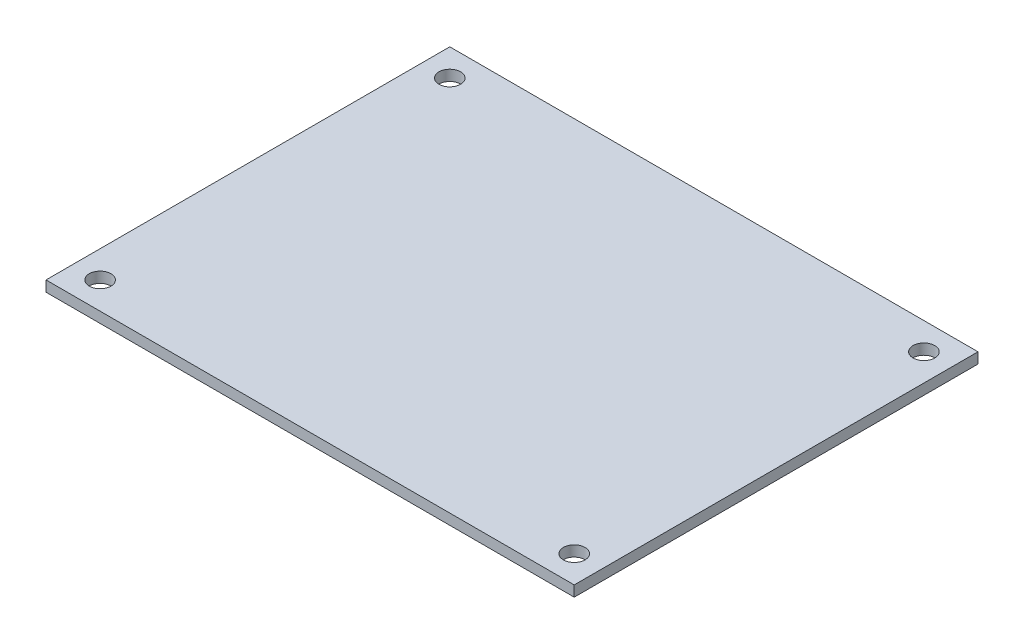
ISO-10303-21;
HEADER;
FILE_DESCRIPTION(('STEP AP214'),'2;1');
FILE_NAME('part.step','',(''),(''),'','','');
FILE_SCHEMA(('AUTOMOTIVE_DESIGN { 1 0 10303 214 1 1 1 1 }'));
ENDSEC;
DATA;
#1=APPLICATION_CONTEXT('core data for automotive mechanical design processes');
#2=APPLICATION_PROTOCOL_DEFINITION('international standard','automotive_design',2000,#1);
#3=PRODUCT_CONTEXT('',#1,'mechanical');
#4=PRODUCT('Part','Part','',(#3));
#5=PRODUCT_RELATED_PRODUCT_CATEGORY('part','',(#4));
#6=PRODUCT_DEFINITION_FORMATION('','',#4);
#7=PRODUCT_DEFINITION_CONTEXT('part definition',#1,'design');
#8=PRODUCT_DEFINITION('design','',#6,#7);
#9=PRODUCT_DEFINITION_SHAPE('','',#8);
#10=(LENGTH_UNIT() NAMED_UNIT(*) SI_UNIT(.MILLI.,.METRE.));
#11=(NAMED_UNIT(*) PLANE_ANGLE_UNIT() SI_UNIT($,.RADIAN.));
#12=(NAMED_UNIT(*) SI_UNIT($,.STERADIAN.) SOLID_ANGLE_UNIT());
#13=UNCERTAINTY_MEASURE_WITH_UNIT(LENGTH_MEASURE(1.E-05),#10,'distance_accuracy_value','');
#14=(GEOMETRIC_REPRESENTATION_CONTEXT(3) GLOBAL_UNCERTAINTY_ASSIGNED_CONTEXT((#13)) GLOBAL_UNIT_ASSIGNED_CONTEXT((#10,
#11,#12)) REPRESENTATION_CONTEXT('',''));
#15=CARTESIAN_POINT('',(0.,0.,0.));
#16=DIRECTION('',(0.,0.,1.));
#17=DIRECTION('',(1.,0.,0.));
#18=AXIS2_PLACEMENT_3D('',#15,#16,#17);
#19=CARTESIAN_POINT('',(0.,2.000000064,0.));
#20=DIRECTION('',(0.,-1.,0.));
#21=DIRECTION('',(0.,0.,-1.));
#22=AXIS2_PLACEMENT_3D('',#19,#20,#21);
#23=PLANE('',#22);
#24=DIRECTION('',(0.,0.,-1.));
#25=VECTOR('',#24,1.);
#26=CARTESIAN_POINT('',(49.594999997,2.000000064,37.909999999));
#27=LINE('',#26,#25);
#28=CARTESIAN_POINT('',(49.594999997,2.000000064,37.909999999));
#29=VERTEX_POINT('',#28);
#30=CARTESIAN_POINT('',(49.594999997,2.000000064,-37.909999999));
#31=VERTEX_POINT('',#30);
#32=EDGE_CURVE('E91',#29,#31,#27,.T.);
#33=ORIENTED_EDGE('',*,*,#32,.T.);
#34=DIRECTION('',(-1.,0.,0.));
#35=VECTOR('',#34,1.);
#36=CARTESIAN_POINT('',(-49.594999997,2.000000064,-37.909999999));
#37=LINE('',#36,#35);
#38=CARTESIAN_POINT('',(-49.594999997,2.000000064,-37.909999999));
#39=VERTEX_POINT('',#38);
#40=EDGE_CURVE('E86',#31,#39,#37,.T.);
#41=ORIENTED_EDGE('',*,*,#40,.T.);
#42=DIRECTION('',(0.,0.,1.));
#43=VECTOR('',#42,1.);
#44=CARTESIAN_POINT('',(-49.594999997,2.000000064,37.909999999));
#45=LINE('',#44,#43);
#46=CARTESIAN_POINT('',(-49.594999997,2.000000064,37.909999999));
#47=VERTEX_POINT('',#46);
#48=EDGE_CURVE('E89',#39,#47,#45,.T.);
#49=ORIENTED_EDGE('',*,*,#48,.T.);
#50=DIRECTION('',(1.,0.,0.));
#51=VECTOR('',#50,1.);
#52=CARTESIAN_POINT('',(-49.594999997,2.000000064,37.909999999));
#53=LINE('',#52,#51);
#54=EDGE_CURVE('E56',#47,#29,#53,.T.);
#55=ORIENTED_EDGE('',*,*,#54,.T.);
#56=EDGE_LOOP('',(#33,#41,#49,#55));
#57=FACE_BOUND('',#56,.T.);
#58=CARTESIAN_POINT('',(-44.514999997,2.000000064,32.829999999));
#59=DIRECTION('',(0.,1.,0.));
#60=DIRECTION('',(0.,0.,1.));
#61=AXIS2_PLACEMENT_3D('',#58,#59,#60);
#62=CIRCLE('',#61,2.03199999999993);
#63=CARTESIAN_POINT('',(-44.514999997,2.000000064,34.8619999989999));
#64=VERTEX_POINT('',#63);
#65=EDGE_CURVE('E106',#64,#64,#62,.T.);
#66=ORIENTED_EDGE('',*,*,#65,.F.);
#67=EDGE_LOOP('',(#66));
#68=FACE_BOUND('',#67,.T.);
#69=CARTESIAN_POINT('',(44.514999997,2.000000064,32.829999999));
#70=DIRECTION('',(0.,1.,0.));
#71=DIRECTION('',(0.,0.,1.));
#72=AXIS2_PLACEMENT_3D('',#69,#70,#71);
#73=CIRCLE('',#72,2.032);
#74=CARTESIAN_POINT('',(44.514999997,2.000000064,34.861999999));
#75=VERTEX_POINT('',#74);
#76=EDGE_CURVE('E121',#75,#75,#73,.T.);
#77=ORIENTED_EDGE('',*,*,#76,.F.);
#78=EDGE_LOOP('',(#77));
#79=FACE_BOUND('',#78,.T.);
#80=CARTESIAN_POINT('',(44.514999997,2.000000064,-32.829999999));
#81=DIRECTION('',(0.,1.,0.));
#82=DIRECTION('',(0.,0.,1.));
#83=AXIS2_PLACEMENT_3D('',#80,#81,#82);
#84=CIRCLE('',#83,2.032);
#85=CARTESIAN_POINT('',(44.514999997,2.000000064,-30.797999999));
#86=VERTEX_POINT('',#85);
#87=EDGE_CURVE('E127',#86,#86,#84,.T.);
#88=ORIENTED_EDGE('',*,*,#87,.F.);
#89=EDGE_LOOP('',(#88));
#90=FACE_BOUND('',#89,.T.);
#91=CARTESIAN_POINT('',(-44.514999997,2.000000064,-32.829999999));
#92=DIRECTION('',(0.,1.,0.));
#93=DIRECTION('',(0.,0.,1.));
#94=AXIS2_PLACEMENT_3D('',#91,#92,#93);
#95=CIRCLE('',#94,2.032);
#96=CARTESIAN_POINT('',(-44.514999997,2.000000064,-30.797999999));
#97=VERTEX_POINT('',#96);
#98=EDGE_CURVE('E133',#97,#97,#95,.T.);
#99=ORIENTED_EDGE('',*,*,#98,.F.);
#100=EDGE_LOOP('',(#99));
#101=FACE_BOUND('',#100,.T.);
#102=ADVANCED_FACE('F39',(#57,#68,#79,#90,#101),#23,.F.);
#103=CARTESIAN_POINT('',(0.,0.,0.));
#104=DIRECTION('',(0.,-1.,0.));
#105=DIRECTION('',(0.,0.,-1.));
#106=AXIS2_PLACEMENT_3D('',#103,#104,#105);
#107=PLANE('',#106);
#108=CARTESIAN_POINT('',(44.514999997,0.,-32.829999999));
#109=DIRECTION('',(0.,1.,0.));
#110=DIRECTION('',(0.,0.,1.));
#111=AXIS2_PLACEMENT_3D('',#108,#109,#110);
#112=CIRCLE('',#111,2.032);
#113=CARTESIAN_POINT('',(44.514999997,0.,-30.797999999));
#114=VERTEX_POINT('',#113);
#115=EDGE_CURVE('E130',#114,#114,#112,.T.);
#116=ORIENTED_EDGE('',*,*,#115,.T.);
#117=EDGE_LOOP('',(#116));
#118=FACE_BOUND('',#117,.T.);
#119=CARTESIAN_POINT('',(-44.514999997,0.,32.829999999));
#120=DIRECTION('',(0.,1.,0.));
#121=DIRECTION('',(0.,0.,1.));
#122=AXIS2_PLACEMENT_3D('',#119,#120,#121);
#123=CIRCLE('',#122,2.03199999999993);
#124=CARTESIAN_POINT('',(-44.514999997,0.,34.8619999989999));
#125=VERTEX_POINT('',#124);
#126=EDGE_CURVE('E118',#125,#125,#123,.T.);
#127=ORIENTED_EDGE('',*,*,#126,.T.);
#128=EDGE_LOOP('',(#127));
#129=FACE_BOUND('',#128,.T.);
#130=DIRECTION('',(0.,0.,-1.));
#131=VECTOR('',#130,1.);
#132=CARTESIAN_POINT('',(49.594999997,0.,37.909999999));
#133=LINE('',#132,#131);
#134=CARTESIAN_POINT('',(49.594999997,0.,37.909999999));
#135=VERTEX_POINT('',#134);
#136=CARTESIAN_POINT('',(49.594999997,0.,-37.909999999));
#137=VERTEX_POINT('',#136);
#138=EDGE_CURVE('E103',#135,#137,#133,.T.);
#139=ORIENTED_EDGE('',*,*,#138,.F.);
#140=DIRECTION('',(1.,0.,0.));
#141=VECTOR('',#140,1.);
#142=CARTESIAN_POINT('',(-49.594999997,0.,37.909999999));
#143=LINE('',#142,#141);
#144=CARTESIAN_POINT('',(-49.594999997,0.,37.909999999));
#145=VERTEX_POINT('',#144);
#146=EDGE_CURVE('E79',#145,#135,#143,.T.);
#147=ORIENTED_EDGE('',*,*,#146,.F.);
#148=DIRECTION('',(0.,0.,1.));
#149=VECTOR('',#148,1.);
#150=CARTESIAN_POINT('',(-49.594999997,0.,37.909999999));
#151=LINE('',#150,#149);
#152=CARTESIAN_POINT('',(-49.594999997,0.,-37.909999999));
#153=VERTEX_POINT('',#152);
#154=EDGE_CURVE('E73',#153,#145,#151,.T.);
#155=ORIENTED_EDGE('',*,*,#154,.F.);
#156=DIRECTION('',(-1.,0.,0.));
#157=VECTOR('',#156,1.);
#158=CARTESIAN_POINT('',(-49.594999997,0.,-37.909999999));
#159=LINE('',#158,#157);
#160=EDGE_CURVE('E95',#137,#153,#159,.T.);
#161=ORIENTED_EDGE('',*,*,#160,.F.);
#162=EDGE_LOOP('',(#139,#147,#155,#161));
#163=FACE_BOUND('',#162,.T.);
#164=CARTESIAN_POINT('',(44.514999997,0.,32.829999999));
#165=DIRECTION('',(0.,1.,0.));
#166=DIRECTION('',(0.,0.,1.));
#167=AXIS2_PLACEMENT_3D('',#164,#165,#166);
#168=CIRCLE('',#167,2.032);
#169=CARTESIAN_POINT('',(44.514999997,0.,34.861999999));
#170=VERTEX_POINT('',#169);
#171=EDGE_CURVE('E124',#170,#170,#168,.T.);
#172=ORIENTED_EDGE('',*,*,#171,.T.);
#173=EDGE_LOOP('',(#172));
#174=FACE_BOUND('',#173,.T.);
#175=CARTESIAN_POINT('',(-44.514999997,0.,-32.829999999));
#176=DIRECTION('',(0.,1.,0.));
#177=DIRECTION('',(0.,0.,1.));
#178=AXIS2_PLACEMENT_3D('',#175,#176,#177);
#179=CIRCLE('',#178,2.032);
#180=CARTESIAN_POINT('',(-44.514999997,0.,-30.797999999));
#181=VERTEX_POINT('',#180);
#182=EDGE_CURVE('E136',#181,#181,#179,.T.);
#183=ORIENTED_EDGE('',*,*,#182,.T.);
#184=EDGE_LOOP('',(#183));
#185=FACE_BOUND('',#184,.T.);
#186=ADVANCED_FACE('F114',(#118,#129,#163,#174,#185),#107,.T.);
#187=CARTESIAN_POINT('',(49.594999997,2.000000064,37.909999999));
#188=DIRECTION('',(-1.,0.,0.));
#189=DIRECTION('',(0.,0.,1.));
#190=AXIS2_PLACEMENT_3D('',#187,#188,#189);
#191=PLANE('',#190);
#192=ORIENTED_EDGE('',*,*,#138,.T.);
#193=DIRECTION('',(0.,-1.,0.));
#194=VECTOR('',#193,1.);
#195=CARTESIAN_POINT('',(49.594999997,2.000000064,-37.909999999));
#196=LINE('',#195,#194);
#197=EDGE_CURVE('E11',#31,#137,#196,.T.);
#198=ORIENTED_EDGE('',*,*,#197,.F.);
#199=ORIENTED_EDGE('',*,*,#32,.F.);
#200=DIRECTION('',(0.,-1.,0.));
#201=VECTOR('',#200,1.);
#202=CARTESIAN_POINT('',(49.594999997,2.000000064,37.909999999));
#203=LINE('',#202,#201);
#204=EDGE_CURVE('E99',#29,#135,#203,.T.);
#205=ORIENTED_EDGE('',*,*,#204,.T.);
#206=EDGE_LOOP('',(#192,#198,#199,#205));
#207=FACE_BOUND('',#206,.T.);
#208=ADVANCED_FACE('F41',(#207),#191,.F.);
#209=CARTESIAN_POINT('',(-49.594999997,2.000000064,-37.909999999));
#210=DIRECTION('',(0.,0.,1.));
#211=DIRECTION('',(1.,0.,0.));
#212=AXIS2_PLACEMENT_3D('',#209,#210,#211);
#213=PLANE('',#212);
#214=ORIENTED_EDGE('',*,*,#160,.T.);
#215=DIRECTION('',(0.,-1.,0.));
#216=VECTOR('',#215,1.);
#217=CARTESIAN_POINT('',(-49.594999997,2.000000064,-37.909999999));
#218=LINE('',#217,#216);
#219=EDGE_CURVE('E48',#39,#153,#218,.T.);
#220=ORIENTED_EDGE('',*,*,#219,.F.);
#221=ORIENTED_EDGE('',*,*,#40,.F.);
#222=ORIENTED_EDGE('',*,*,#197,.T.);
#223=EDGE_LOOP('',(#214,#220,#221,#222));
#224=FACE_BOUND('',#223,.T.);
#225=ADVANCED_FACE('F94',(#224),#213,.F.);
#226=CARTESIAN_POINT('',(-49.594999997,2.000000064,37.909999999));
#227=DIRECTION('',(1.,0.,0.));
#228=DIRECTION('',(0.,0.,-1.));
#229=AXIS2_PLACEMENT_3D('',#226,#227,#228);
#230=PLANE('',#229);
#231=ORIENTED_EDGE('',*,*,#154,.T.);
#232=DIRECTION('',(0.,-1.,0.));
#233=VECTOR('',#232,1.);
#234=CARTESIAN_POINT('',(-49.594999997,2.000000064,37.909999999));
#235=LINE('',#234,#233);
#236=EDGE_CURVE('E96',#47,#145,#235,.T.);
#237=ORIENTED_EDGE('',*,*,#236,.F.);
#238=ORIENTED_EDGE('',*,*,#48,.F.);
#239=ORIENTED_EDGE('',*,*,#219,.T.);
#240=EDGE_LOOP('',(#231,#237,#238,#239));
#241=FACE_BOUND('',#240,.T.);
#242=ADVANCED_FACE('F97',(#241),#230,.F.);
#243=CARTESIAN_POINT('',(-49.594999997,2.000000064,37.909999999));
#244=DIRECTION('',(0.,0.,-1.));
#245=DIRECTION('',(-1.,0.,0.));
#246=AXIS2_PLACEMENT_3D('',#243,#244,#245);
#247=PLANE('',#246);
#248=ORIENTED_EDGE('',*,*,#146,.T.);
#249=ORIENTED_EDGE('',*,*,#204,.F.);
#250=ORIENTED_EDGE('',*,*,#54,.F.);
#251=ORIENTED_EDGE('',*,*,#236,.T.);
#252=EDGE_LOOP('',(#248,#249,#250,#251));
#253=FACE_BOUND('',#252,.T.);
#254=ADVANCED_FACE('F111',(#253),#247,.F.);
#255=CARTESIAN_POINT('',(-44.514999997,2.000000064,32.829999999));
#256=DIRECTION('',(0.,-1.,0.));
#257=DIRECTION('',(0.,0.,-1.));
#258=AXIS2_PLACEMENT_3D('',#255,#256,#257);
#259=CYLINDRICAL_SURFACE('',#258,2.03199999999993);
#260=ORIENTED_EDGE('',*,*,#65,.T.);
#261=EDGE_LOOP('',(#260));
#262=FACE_BOUND('',#261,.T.);
#263=ORIENTED_EDGE('',*,*,#126,.F.);
#264=EDGE_LOOP('',(#263));
#265=FACE_BOUND('',#264,.T.);
#266=ADVANCED_FACE('F153',(#262,#265),#259,.F.);
#267=CARTESIAN_POINT('',(44.514999997,2.000000064,32.829999999));
#268=DIRECTION('',(0.,-1.,0.));
#269=DIRECTION('',(0.,0.,-1.));
#270=AXIS2_PLACEMENT_3D('',#267,#268,#269);
#271=CYLINDRICAL_SURFACE('',#270,2.032);
#272=ORIENTED_EDGE('',*,*,#76,.T.);
#273=EDGE_LOOP('',(#272));
#274=FACE_BOUND('',#273,.T.);
#275=ORIENTED_EDGE('',*,*,#171,.F.);
#276=EDGE_LOOP('',(#275));
#277=FACE_BOUND('',#276,.T.);
#278=ADVANCED_FACE('F198',(#274,#277),#271,.F.);
#279=CARTESIAN_POINT('',(44.514999997,2.000000064,-32.829999999));
#280=DIRECTION('',(0.,-1.,0.));
#281=DIRECTION('',(0.,0.,-1.));
#282=AXIS2_PLACEMENT_3D('',#279,#280,#281);
#283=CYLINDRICAL_SURFACE('',#282,2.032);
#284=ORIENTED_EDGE('',*,*,#87,.T.);
#285=EDGE_LOOP('',(#284));
#286=FACE_BOUND('',#285,.T.);
#287=ORIENTED_EDGE('',*,*,#115,.F.);
#288=EDGE_LOOP('',(#287));
#289=FACE_BOUND('',#288,.T.);
#290=ADVANCED_FACE('F206',(#286,#289),#283,.F.);
#291=CARTESIAN_POINT('',(-44.514999997,2.000000064,-32.829999999));
#292=DIRECTION('',(0.,-1.,0.));
#293=DIRECTION('',(0.,0.,-1.));
#294=AXIS2_PLACEMENT_3D('',#291,#292,#293);
#295=CYLINDRICAL_SURFACE('',#294,2.032);
#296=ORIENTED_EDGE('',*,*,#98,.T.);
#297=EDGE_LOOP('',(#296));
#298=FACE_BOUND('',#297,.T.);
#299=ORIENTED_EDGE('',*,*,#182,.F.);
#300=EDGE_LOOP('',(#299));
#301=FACE_BOUND('',#300,.T.);
#302=ADVANCED_FACE('F142',(#298,#301),#295,.F.);
#303=CLOSED_SHELL('',(#102,#186,#208,#225,#242,#254,#266,#278,#290,#302));
#304=MANIFOLD_SOLID_BREP('B2',#303);
#305=ADVANCED_BREP_SHAPE_REPRESENTATION('',(#18,#304),#14);
#306=SHAPE_DEFINITION_REPRESENTATION(#9,#305);
ENDSEC;
END-ISO-10303-21;
